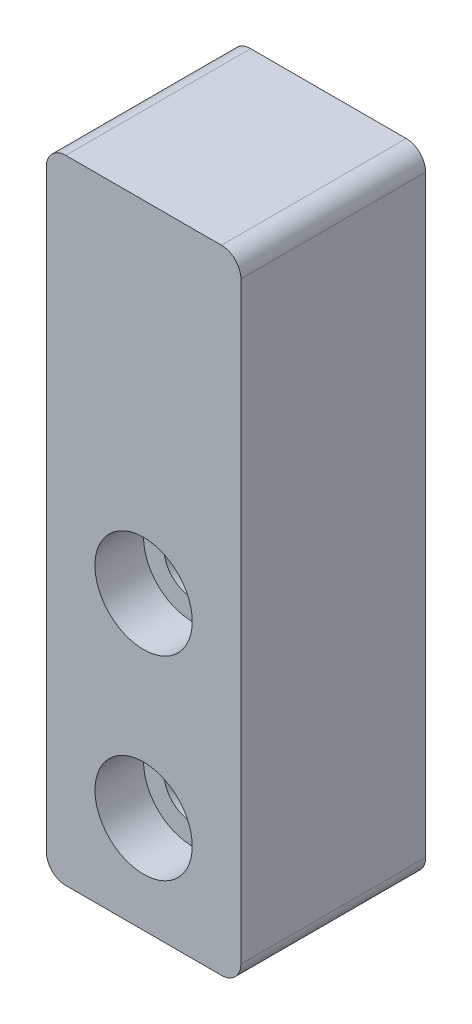
ISO-10303-21;
HEADER;
FILE_DESCRIPTION(('STEP AP214'),'2;1');
FILE_NAME('part.step','',(''),(''),'','','');
FILE_SCHEMA(('AUTOMOTIVE_DESIGN { 1 0 10303 214 1 1 1 1 }'));
ENDSEC;
DATA;
#1=APPLICATION_CONTEXT('core data for automotive mechanical design processes');
#2=APPLICATION_PROTOCOL_DEFINITION('international standard','automotive_design',2000,#1);
#3=PRODUCT_CONTEXT('',#1,'mechanical');
#4=PRODUCT('Part','Part','',(#3));
#5=PRODUCT_RELATED_PRODUCT_CATEGORY('part','',(#4));
#6=PRODUCT_DEFINITION_FORMATION('','',#4);
#7=PRODUCT_DEFINITION_CONTEXT('part definition',#1,'design');
#8=PRODUCT_DEFINITION('design','',#6,#7);
#9=PRODUCT_DEFINITION_SHAPE('','',#8);
#10=(LENGTH_UNIT() NAMED_UNIT(*) SI_UNIT(.MILLI.,.METRE.));
#11=(NAMED_UNIT(*) PLANE_ANGLE_UNIT() SI_UNIT($,.RADIAN.));
#12=(NAMED_UNIT(*) SI_UNIT($,.STERADIAN.) SOLID_ANGLE_UNIT());
#13=UNCERTAINTY_MEASURE_WITH_UNIT(LENGTH_MEASURE(1.E-05),#10,'distance_accuracy_value','');
#14=(GEOMETRIC_REPRESENTATION_CONTEXT(3) GLOBAL_UNCERTAINTY_ASSIGNED_CONTEXT((#13)) GLOBAL_UNIT_ASSIGNED_CONTEXT((#10,
#11,#12)) REPRESENTATION_CONTEXT('',''));
#15=CARTESIAN_POINT('',(0.,0.,0.));
#16=DIRECTION('',(0.,0.,1.));
#17=DIRECTION('',(1.,0.,0.));
#18=AXIS2_PLACEMENT_3D('',#15,#16,#17);
#19=CARTESIAN_POINT('',(9.99999999999999,32.5,19.));
#20=DIRECTION('',(-1.,0.,0.));
#21=DIRECTION('',(0.,-1.,0.));
#22=AXIS2_PLACEMENT_3D('',#19,#20,#21);
#23=PLANE('',#22);
#24=DIRECTION('',(0.,1.,0.));
#25=VECTOR('',#24,1.);
#26=CARTESIAN_POINT('',(9.99999999999999,32.5,19.));
#27=LINE('',#26,#25);
#28=CARTESIAN_POINT('',(10.,-30.5,19.));
#29=VERTEX_POINT('',#28);
#30=CARTESIAN_POINT('',(9.99999999999999,30.5,19.));
#31=VERTEX_POINT('',#30);
#32=EDGE_CURVE('E128',#29,#31,#27,.T.);
#33=ORIENTED_EDGE('',*,*,#32,.F.);
#34=DIRECTION('',(0.,0.,-1.));
#35=VECTOR('',#34,1.);
#36=CARTESIAN_POINT('',(10.,-30.5,19.));
#37=LINE('',#36,#35);
#38=CARTESIAN_POINT('',(10.,-30.5,0.));
#39=VERTEX_POINT('',#38);
#40=EDGE_CURVE('E113',#29,#39,#37,.T.);
#41=ORIENTED_EDGE('',*,*,#40,.T.);
#42=DIRECTION('',(0.,1.,0.));
#43=VECTOR('',#42,1.);
#44=CARTESIAN_POINT('',(9.99999999999999,32.5,0.));
#45=LINE('',#44,#43);
#46=CARTESIAN_POINT('',(9.99999999999999,30.5,0.));
#47=VERTEX_POINT('',#46);
#48=EDGE_CURVE('E130',#39,#47,#45,.T.);
#49=ORIENTED_EDGE('',*,*,#48,.T.);
#50=DIRECTION('',(0.,0.,-1.));
#51=VECTOR('',#50,1.);
#52=CARTESIAN_POINT('',(9.99999999999999,30.5,19.));
#53=LINE('',#52,#51);
#54=EDGE_CURVE('E135',#47,#31,#53,.F.);
#55=ORIENTED_EDGE('',*,*,#54,.T.);
#56=EDGE_LOOP('',(#33,#41,#49,#55));
#57=FACE_BOUND('',#56,.T.);
#58=ADVANCED_FACE('F44',(#57),#23,.F.);
#59=CARTESIAN_POINT('',(-10.,32.5,19.));
#60=DIRECTION('',(0.,-1.,0.));
#61=DIRECTION('',(0.,0.,-1.));
#62=AXIS2_PLACEMENT_3D('',#59,#60,#61);
#63=PLANE('',#62);
#64=DIRECTION('',(-1.,0.,0.));
#65=VECTOR('',#64,1.);
#66=CARTESIAN_POINT('',(-10.,32.5,0.));
#67=LINE('',#66,#65);
#68=CARTESIAN_POINT('',(7.99999999999999,32.5,0.));
#69=VERTEX_POINT('',#68);
#70=CARTESIAN_POINT('',(-8.00000000000001,32.5,0.));
#71=VERTEX_POINT('',#70);
#72=EDGE_CURVE('E137',#69,#71,#67,.T.);
#73=ORIENTED_EDGE('',*,*,#72,.T.);
#74=DIRECTION('',(0.,0.,-1.));
#75=VECTOR('',#74,1.);
#76=CARTESIAN_POINT('',(-8.00000000000001,32.5,19.));
#77=LINE('',#76,#75);
#78=CARTESIAN_POINT('',(-8.00000000000001,32.5,19.));
#79=VERTEX_POINT('',#78);
#80=EDGE_CURVE('E11',#71,#79,#77,.F.);
#81=ORIENTED_EDGE('',*,*,#80,.T.);
#82=DIRECTION('',(-1.,0.,0.));
#83=VECTOR('',#82,1.);
#84=CARTESIAN_POINT('',(-10.,32.5,19.));
#85=LINE('',#84,#83);
#86=CARTESIAN_POINT('',(7.99999999999999,32.5,19.));
#87=VERTEX_POINT('',#86);
#88=EDGE_CURVE('E180',#87,#79,#85,.T.);
#89=ORIENTED_EDGE('',*,*,#88,.F.);
#90=DIRECTION('',(0.,0.,-1.));
#91=VECTOR('',#90,1.);
#92=CARTESIAN_POINT('',(7.99999999999999,32.5,19.));
#93=LINE('',#92,#91);
#94=EDGE_CURVE('E52',#87,#69,#93,.T.);
#95=ORIENTED_EDGE('',*,*,#94,.T.);
#96=EDGE_LOOP('',(#73,#81,#89,#95));
#97=FACE_BOUND('',#96,.T.);
#98=ADVANCED_FACE('F172',(#97),#63,.F.);
#99=CARTESIAN_POINT('',(-10.,32.5,19.));
#100=DIRECTION('',(1.,0.,0.));
#101=DIRECTION('',(0.,1.,0.));
#102=AXIS2_PLACEMENT_3D('',#99,#100,#101);
#103=PLANE('',#102);
#104=DIRECTION('',(0.,-1.,0.));
#105=VECTOR('',#104,1.);
#106=CARTESIAN_POINT('',(-10.,32.5,0.));
#107=LINE('',#106,#105);
#108=CARTESIAN_POINT('',(-10.,30.5,0.));
#109=VERTEX_POINT('',#108);
#110=CARTESIAN_POINT('',(-10.,-30.5,0.));
#111=VERTEX_POINT('',#110);
#112=EDGE_CURVE('E138',#109,#111,#107,.T.);
#113=ORIENTED_EDGE('',*,*,#112,.T.);
#114=DIRECTION('',(0.,0.,-1.));
#115=VECTOR('',#114,1.);
#116=CARTESIAN_POINT('',(-10.,-30.5,19.));
#117=LINE('',#116,#115);
#118=CARTESIAN_POINT('',(-10.,-30.5,19.));
#119=VERTEX_POINT('',#118);
#120=EDGE_CURVE('E58',#111,#119,#117,.F.);
#121=ORIENTED_EDGE('',*,*,#120,.T.);
#122=DIRECTION('',(0.,-1.,0.));
#123=VECTOR('',#122,1.);
#124=CARTESIAN_POINT('',(-10.,32.5,19.));
#125=LINE('',#124,#123);
#126=CARTESIAN_POINT('',(-10.,30.5,19.));
#127=VERTEX_POINT('',#126);
#128=EDGE_CURVE('E183',#127,#119,#125,.T.);
#129=ORIENTED_EDGE('',*,*,#128,.F.);
#130=DIRECTION('',(0.,0.,-1.));
#131=VECTOR('',#130,1.);
#132=CARTESIAN_POINT('',(-10.,30.5,19.));
#133=LINE('',#132,#131);
#134=EDGE_CURVE('E169',#127,#109,#133,.T.);
#135=ORIENTED_EDGE('',*,*,#134,.T.);
#136=EDGE_LOOP('',(#113,#121,#129,#135));
#137=FACE_BOUND('',#136,.T.);
#138=ADVANCED_FACE('F184',(#137),#103,.F.);
#139=CARTESIAN_POINT('',(-10.,-32.5,19.));
#140=DIRECTION('',(0.,1.,0.));
#141=DIRECTION('',(0.,0.,1.));
#142=AXIS2_PLACEMENT_3D('',#139,#140,#141);
#143=PLANE('',#142);
#144=DIRECTION('',(1.,0.,0.));
#145=VECTOR('',#144,1.);
#146=CARTESIAN_POINT('',(-10.,-32.5,0.));
#147=LINE('',#146,#145);
#148=CARTESIAN_POINT('',(-8.,-32.5,0.));
#149=VERTEX_POINT('',#148);
#150=CARTESIAN_POINT('',(8.,-32.5,0.));
#151=VERTEX_POINT('',#150);
#152=EDGE_CURVE('E151',#149,#151,#147,.T.);
#153=ORIENTED_EDGE('',*,*,#152,.T.);
#154=DIRECTION('',(0.,0.,-1.));
#155=VECTOR('',#154,1.);
#156=CARTESIAN_POINT('',(8.,-32.5,19.));
#157=LINE('',#156,#155);
#158=CARTESIAN_POINT('',(8.,-32.5,19.));
#159=VERTEX_POINT('',#158);
#160=EDGE_CURVE('E118',#151,#159,#157,.F.);
#161=ORIENTED_EDGE('',*,*,#160,.T.);
#162=DIRECTION('',(1.,0.,0.));
#163=VECTOR('',#162,1.);
#164=CARTESIAN_POINT('',(-10.,-32.5,19.));
#165=LINE('',#164,#163);
#166=CARTESIAN_POINT('',(-8.,-32.5,19.));
#167=VERTEX_POINT('',#166);
#168=EDGE_CURVE('E148',#167,#159,#165,.T.);
#169=ORIENTED_EDGE('',*,*,#168,.F.);
#170=DIRECTION('',(0.,0.,-1.));
#171=VECTOR('',#170,1.);
#172=CARTESIAN_POINT('',(-8.,-32.5,19.));
#173=LINE('',#172,#171);
#174=EDGE_CURVE('E122',#167,#149,#173,.T.);
#175=ORIENTED_EDGE('',*,*,#174,.T.);
#176=EDGE_LOOP('',(#153,#161,#169,#175));
#177=FACE_BOUND('',#176,.T.);
#178=ADVANCED_FACE('F225',(#177),#143,.F.);
#179=CARTESIAN_POINT('',(0.,0.,19.));
#180=DIRECTION('',(0.,0.,1.));
#181=DIRECTION('',(1.,0.,0.));
#182=AXIS2_PLACEMENT_3D('',#179,#180,#181);
#183=PLANE('',#182);
#184=CARTESIAN_POINT('',(0.,-2.5,19.));
#185=DIRECTION('',(0.,0.,1.));
#186=DIRECTION('',(1.,0.,0.));
#187=AXIS2_PLACEMENT_3D('',#184,#185,#186);
#188=CIRCLE('',#187,5.);
#189=CARTESIAN_POINT('',(5.,-2.5,19.));
#190=VERTEX_POINT('',#189);
#191=EDGE_CURVE('E213',#190,#190,#188,.T.);
#192=ORIENTED_EDGE('',*,*,#191,.F.);
#193=EDGE_LOOP('',(#192));
#194=FACE_BOUND('',#193,.T.);
#195=CARTESIAN_POINT('',(0.,-22.5,19.));
#196=DIRECTION('',(0.,0.,1.));
#197=DIRECTION('',(1.,0.,0.));
#198=AXIS2_PLACEMENT_3D('',#195,#196,#197);
#199=CIRCLE('',#198,5.);
#200=CARTESIAN_POINT('',(5.,-22.5,19.));
#201=VERTEX_POINT('',#200);
#202=EDGE_CURVE('E196',#201,#201,#199,.T.);
#203=ORIENTED_EDGE('',*,*,#202,.F.);
#204=EDGE_LOOP('',(#203));
#205=FACE_BOUND('',#204,.T.);
#206=ORIENTED_EDGE('',*,*,#168,.T.);
#207=CARTESIAN_POINT('',(8.,-30.5,19.));
#208=DIRECTION('',(0.,0.,1.));
#209=DIRECTION('',(1.,0.,0.));
#210=AXIS2_PLACEMENT_3D('',#207,#208,#209);
#211=CIRCLE('',#210,2.);
#212=EDGE_CURVE('E167',#159,#29,#211,.T.);
#213=ORIENTED_EDGE('',*,*,#212,.T.);
#214=ORIENTED_EDGE('',*,*,#32,.T.);
#215=CARTESIAN_POINT('',(7.99999999999999,30.5,19.));
#216=DIRECTION('',(0.,0.,1.));
#217=DIRECTION('',(1.,0.,0.));
#218=AXIS2_PLACEMENT_3D('',#215,#216,#217);
#219=CIRCLE('',#218,2.);
#220=EDGE_CURVE('E161',#31,#87,#219,.T.);
#221=ORIENTED_EDGE('',*,*,#220,.T.);
#222=ORIENTED_EDGE('',*,*,#88,.T.);
#223=CARTESIAN_POINT('',(-8.00000000000001,30.5,19.));
#224=DIRECTION('',(0.,0.,1.));
#225=DIRECTION('',(1.,0.,0.));
#226=AXIS2_PLACEMENT_3D('',#223,#224,#225);
#227=CIRCLE('',#226,2.);
#228=EDGE_CURVE('E70',#79,#127,#227,.T.);
#229=ORIENTED_EDGE('',*,*,#228,.T.);
#230=ORIENTED_EDGE('',*,*,#128,.T.);
#231=CARTESIAN_POINT('',(-8.,-30.5,19.));
#232=DIRECTION('',(0.,0.,1.));
#233=DIRECTION('',(1.,0.,0.));
#234=AXIS2_PLACEMENT_3D('',#231,#232,#233);
#235=CIRCLE('',#234,2.);
#236=EDGE_CURVE('E163',#119,#167,#235,.T.);
#237=ORIENTED_EDGE('',*,*,#236,.T.);
#238=EDGE_LOOP('',(#206,#213,#214,#221,#222,#229,#230,#237));
#239=FACE_BOUND('',#238,.T.);
#240=ADVANCED_FACE('F218',(#194,#205,#239),#183,.T.);
#241=CARTESIAN_POINT('',(0.,0.,0.));
#242=DIRECTION('',(0.,0.,1.));
#243=DIRECTION('',(1.,0.,0.));
#244=AXIS2_PLACEMENT_3D('',#241,#242,#243);
#245=PLANE('',#244);
#246=CARTESIAN_POINT('',(0.,-2.5,0.));
#247=DIRECTION('',(0.,0.,1.));
#248=DIRECTION('',(1.,0.,0.));
#249=AXIS2_PLACEMENT_3D('',#246,#247,#248);
#250=CIRCLE('',#249,2.9);
#251=CARTESIAN_POINT('',(2.9,-2.5,0.));
#252=VERTEX_POINT('',#251);
#253=EDGE_CURVE('E203',#252,#252,#250,.T.);
#254=ORIENTED_EDGE('',*,*,#253,.T.);
#255=EDGE_LOOP('',(#254));
#256=FACE_BOUND('',#255,.T.);
#257=CARTESIAN_POINT('',(0.,-22.5,0.));
#258=DIRECTION('',(0.,0.,1.));
#259=DIRECTION('',(1.,0.,0.));
#260=AXIS2_PLACEMENT_3D('',#257,#258,#259);
#261=CIRCLE('',#260,2.9);
#262=CARTESIAN_POINT('',(2.9,-22.5,0.));
#263=VERTEX_POINT('',#262);
#264=EDGE_CURVE('E140',#263,#263,#261,.T.);
#265=ORIENTED_EDGE('',*,*,#264,.T.);
#266=EDGE_LOOP('',(#265));
#267=FACE_BOUND('',#266,.T.);
#268=ORIENTED_EDGE('',*,*,#48,.F.);
#269=CARTESIAN_POINT('',(8.,-30.5,0.));
#270=DIRECTION('',(0.,0.,1.));
#271=DIRECTION('',(1.,0.,0.));
#272=AXIS2_PLACEMENT_3D('',#269,#270,#271);
#273=CIRCLE('',#272,2.);
#274=EDGE_CURVE('E112',#39,#151,#273,.F.);
#275=ORIENTED_EDGE('',*,*,#274,.T.);
#276=ORIENTED_EDGE('',*,*,#152,.F.);
#277=CARTESIAN_POINT('',(-8.,-30.5,0.));
#278=DIRECTION('',(0.,0.,1.));
#279=DIRECTION('',(1.,0.,0.));
#280=AXIS2_PLACEMENT_3D('',#277,#278,#279);
#281=CIRCLE('',#280,2.);
#282=EDGE_CURVE('E125',#149,#111,#281,.F.);
#283=ORIENTED_EDGE('',*,*,#282,.T.);
#284=ORIENTED_EDGE('',*,*,#112,.F.);
#285=CARTESIAN_POINT('',(-8.00000000000001,30.5,0.));
#286=DIRECTION('',(0.,0.,1.));
#287=DIRECTION('',(1.,0.,0.));
#288=AXIS2_PLACEMENT_3D('',#285,#286,#287);
#289=CIRCLE('',#288,2.);
#290=EDGE_CURVE('E154',#109,#71,#289,.F.);
#291=ORIENTED_EDGE('',*,*,#290,.T.);
#292=ORIENTED_EDGE('',*,*,#72,.F.);
#293=CARTESIAN_POINT('',(7.99999999999999,30.5,0.));
#294=DIRECTION('',(0.,0.,1.));
#295=DIRECTION('',(1.,0.,0.));
#296=AXIS2_PLACEMENT_3D('',#293,#294,#295);
#297=CIRCLE('',#296,2.);
#298=EDGE_CURVE('E133',#69,#47,#297,.F.);
#299=ORIENTED_EDGE('',*,*,#298,.T.);
#300=EDGE_LOOP('',(#268,#275,#276,#283,#284,#291,#292,#299));
#301=FACE_BOUND('',#300,.T.);
#302=ADVANCED_FACE('F134',(#256,#267,#301),#245,.F.);
#303=CARTESIAN_POINT('',(0.,-22.5,19.));
#304=DIRECTION('',(0.,0.,1.));
#305=DIRECTION('',(1.,0.,0.));
#306=AXIS2_PLACEMENT_3D('',#303,#304,#305);
#307=CYLINDRICAL_SURFACE('',#306,2.9);
#308=ORIENTED_EDGE('',*,*,#264,.F.);
#309=EDGE_LOOP('',(#308));
#310=FACE_BOUND('',#309,.T.);
#311=CARTESIAN_POINT('',(0.,-22.5,14.));
#312=DIRECTION('',(0.,0.,1.));
#313=DIRECTION('',(1.,0.,0.));
#314=AXIS2_PLACEMENT_3D('',#311,#312,#313);
#315=CIRCLE('',#314,2.9);
#316=CARTESIAN_POINT('',(2.9,-22.5,14.));
#317=VERTEX_POINT('',#316);
#318=EDGE_CURVE('E141',#317,#317,#315,.T.);
#319=ORIENTED_EDGE('',*,*,#318,.T.);
#320=EDGE_LOOP('',(#319));
#321=FACE_BOUND('',#320,.T.);
#322=ADVANCED_FACE('F246',(#310,#321),#307,.F.);
#323=CARTESIAN_POINT('',(2.9,-22.5,14.));
#324=DIRECTION('',(0.,0.,-1.));
#325=DIRECTION('',(-1.,0.,0.));
#326=AXIS2_PLACEMENT_3D('',#323,#324,#325);
#327=PLANE('',#326);
#328=ORIENTED_EDGE('',*,*,#318,.F.);
#329=EDGE_LOOP('',(#328));
#330=FACE_BOUND('',#329,.T.);
#331=CARTESIAN_POINT('',(0.,-22.5,14.));
#332=DIRECTION('',(0.,0.,1.));
#333=DIRECTION('',(1.,0.,0.));
#334=AXIS2_PLACEMENT_3D('',#331,#332,#333);
#335=CIRCLE('',#334,5.);
#336=CARTESIAN_POINT('',(5.,-22.5,14.));
#337=VERTEX_POINT('',#336);
#338=EDGE_CURVE('E193',#337,#337,#335,.T.);
#339=ORIENTED_EDGE('',*,*,#338,.T.);
#340=EDGE_LOOP('',(#339));
#341=FACE_BOUND('',#340,.T.);
#342=ADVANCED_FACE('F255',(#330,#341),#327,.F.);
#343=CARTESIAN_POINT('',(0.,-22.5,19.));
#344=DIRECTION('',(0.,0.,1.));
#345=DIRECTION('',(1.,0.,0.));
#346=AXIS2_PLACEMENT_3D('',#343,#344,#345);
#347=CYLINDRICAL_SURFACE('',#346,5.);
#348=ORIENTED_EDGE('',*,*,#338,.F.);
#349=EDGE_LOOP('',(#348));
#350=FACE_BOUND('',#349,.T.);
#351=ORIENTED_EDGE('',*,*,#202,.T.);
#352=EDGE_LOOP('',(#351));
#353=FACE_BOUND('',#352,.T.);
#354=ADVANCED_FACE('F256',(#350,#353),#347,.F.);
#355=CARTESIAN_POINT('',(0.,-2.5,19.));
#356=DIRECTION('',(0.,0.,1.));
#357=DIRECTION('',(1.,0.,0.));
#358=AXIS2_PLACEMENT_3D('',#355,#356,#357);
#359=CYLINDRICAL_SURFACE('',#358,2.9);
#360=ORIENTED_EDGE('',*,*,#253,.F.);
#361=EDGE_LOOP('',(#360));
#362=FACE_BOUND('',#361,.T.);
#363=CARTESIAN_POINT('',(0.,-2.5,14.));
#364=DIRECTION('',(0.,0.,1.));
#365=DIRECTION('',(1.,0.,0.));
#366=AXIS2_PLACEMENT_3D('',#363,#364,#365);
#367=CIRCLE('',#366,2.9);
#368=CARTESIAN_POINT('',(2.9,-2.5,14.));
#369=VERTEX_POINT('',#368);
#370=EDGE_CURVE('E202',#369,#369,#367,.T.);
#371=ORIENTED_EDGE('',*,*,#370,.T.);
#372=EDGE_LOOP('',(#371));
#373=FACE_BOUND('',#372,.T.);
#374=ADVANCED_FACE('F265',(#362,#373),#359,.F.);
#375=CARTESIAN_POINT('',(2.9,-2.5,14.));
#376=DIRECTION('',(0.,0.,-1.));
#377=DIRECTION('',(-1.,0.,0.));
#378=AXIS2_PLACEMENT_3D('',#375,#376,#377);
#379=PLANE('',#378);
#380=ORIENTED_EDGE('',*,*,#370,.F.);
#381=EDGE_LOOP('',(#380));
#382=FACE_BOUND('',#381,.T.);
#383=CARTESIAN_POINT('',(0.,-2.5,14.));
#384=DIRECTION('',(0.,0.,1.));
#385=DIRECTION('',(1.,0.,0.));
#386=AXIS2_PLACEMENT_3D('',#383,#384,#385);
#387=CIRCLE('',#386,5.);
#388=CARTESIAN_POINT('',(5.,-2.5,14.));
#389=VERTEX_POINT('',#388);
#390=EDGE_CURVE('E207',#389,#389,#387,.T.);
#391=ORIENTED_EDGE('',*,*,#390,.T.);
#392=EDGE_LOOP('',(#391));
#393=FACE_BOUND('',#392,.T.);
#394=ADVANCED_FACE('F264',(#382,#393),#379,.F.);
#395=CARTESIAN_POINT('',(0.,-2.5,19.));
#396=DIRECTION('',(0.,0.,1.));
#397=DIRECTION('',(1.,0.,0.));
#398=AXIS2_PLACEMENT_3D('',#395,#396,#397);
#399=CYLINDRICAL_SURFACE('',#398,5.);
#400=ORIENTED_EDGE('',*,*,#390,.F.);
#401=EDGE_LOOP('',(#400));
#402=FACE_BOUND('',#401,.T.);
#403=ORIENTED_EDGE('',*,*,#191,.T.);
#404=EDGE_LOOP('',(#403));
#405=FACE_BOUND('',#404,.T.);
#406=ADVANCED_FACE('F220',(#402,#405),#399,.F.);
#407=CARTESIAN_POINT('',(8.,-30.5,19.));
#408=DIRECTION('',(0.,0.,-1.));
#409=DIRECTION('',(-1.,0.,0.));
#410=AXIS2_PLACEMENT_3D('',#407,#408,#409);
#411=CYLINDRICAL_SURFACE('',#410,2.);
#412=ORIENTED_EDGE('',*,*,#212,.F.);
#413=ORIENTED_EDGE('',*,*,#160,.F.);
#414=ORIENTED_EDGE('',*,*,#274,.F.);
#415=ORIENTED_EDGE('',*,*,#40,.F.);
#416=EDGE_LOOP('',(#412,#413,#414,#415));
#417=FACE_BOUND('',#416,.T.);
#418=ADVANCED_FACE('F111',(#417),#411,.T.);
#419=CARTESIAN_POINT('',(-8.,-30.5,19.));
#420=DIRECTION('',(0.,0.,-1.));
#421=DIRECTION('',(-1.,0.,0.));
#422=AXIS2_PLACEMENT_3D('',#419,#420,#421);
#423=CYLINDRICAL_SURFACE('',#422,2.);
#424=ORIENTED_EDGE('',*,*,#236,.F.);
#425=ORIENTED_EDGE('',*,*,#120,.F.);
#426=ORIENTED_EDGE('',*,*,#282,.F.);
#427=ORIENTED_EDGE('',*,*,#174,.F.);
#428=EDGE_LOOP('',(#424,#425,#426,#427));
#429=FACE_BOUND('',#428,.T.);
#430=ADVANCED_FACE('F229',(#429),#423,.T.);
#431=CARTESIAN_POINT('',(-8.00000000000001,30.5,19.));
#432=DIRECTION('',(0.,0.,-1.));
#433=DIRECTION('',(-1.,0.,0.));
#434=AXIS2_PLACEMENT_3D('',#431,#432,#433);
#435=CYLINDRICAL_SURFACE('',#434,2.);
#436=ORIENTED_EDGE('',*,*,#228,.F.);
#437=ORIENTED_EDGE('',*,*,#80,.F.);
#438=ORIENTED_EDGE('',*,*,#290,.F.);
#439=ORIENTED_EDGE('',*,*,#134,.F.);
#440=EDGE_LOOP('',(#436,#437,#438,#439));
#441=FACE_BOUND('',#440,.T.);
#442=ADVANCED_FACE('F181',(#441),#435,.T.);
#443=CARTESIAN_POINT('',(7.99999999999999,30.5,19.));
#444=DIRECTION('',(0.,0.,-1.));
#445=DIRECTION('',(-1.,0.,0.));
#446=AXIS2_PLACEMENT_3D('',#443,#444,#445);
#447=CYLINDRICAL_SURFACE('',#446,2.);
#448=ORIENTED_EDGE('',*,*,#220,.F.);
#449=ORIENTED_EDGE('',*,*,#54,.F.);
#450=ORIENTED_EDGE('',*,*,#298,.F.);
#451=ORIENTED_EDGE('',*,*,#94,.F.);
#452=EDGE_LOOP('',(#448,#449,#450,#451));
#453=FACE_BOUND('',#452,.T.);
#454=ADVANCED_FACE('F50',(#453),#447,.T.);
#455=CLOSED_SHELL('',(#58,#98,#138,#178,#240,#302,#322,#342,#354,#374,#394,#406,#418,#430,#442,#454));
#456=MANIFOLD_SOLID_BREP('B2',#455);
#457=ADVANCED_BREP_SHAPE_REPRESENTATION('',(#18,#456),#14);
#458=SHAPE_DEFINITION_REPRESENTATION(#9,#457);
ENDSEC;
END-ISO-10303-21;
